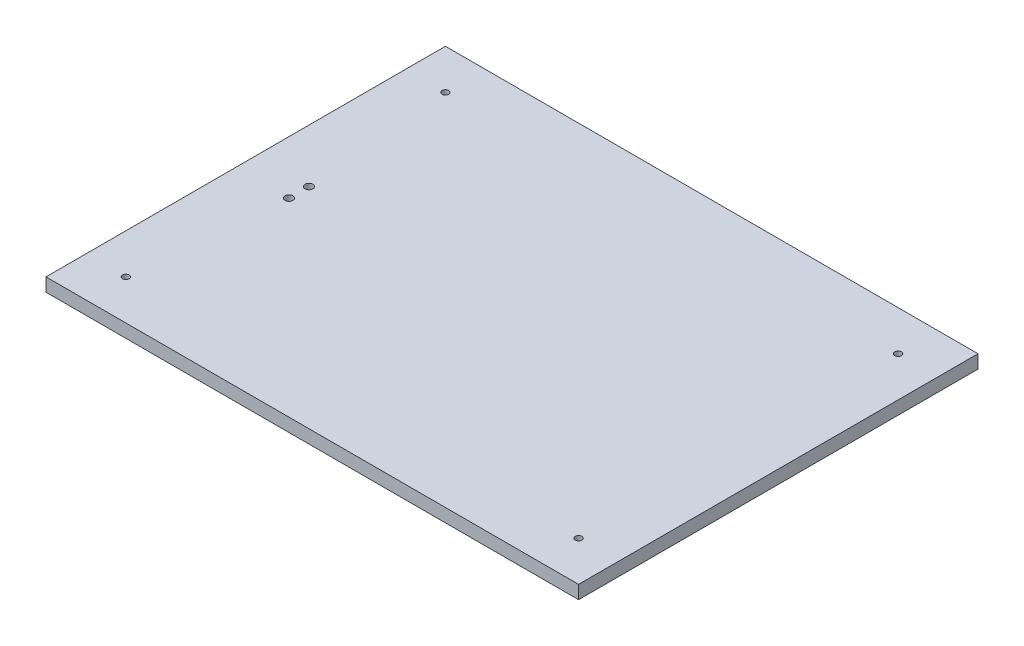
ISO-10303-21;
HEADER;
FILE_DESCRIPTION(('STEP AP214'),'2;1');
FILE_NAME('part.step','',(''),(''),'','','');
FILE_SCHEMA(('AUTOMOTIVE_DESIGN { 1 0 10303 214 1 1 1 1 }'));
ENDSEC;
DATA;
#1=APPLICATION_CONTEXT('core data for automotive mechanical design processes');
#2=APPLICATION_PROTOCOL_DEFINITION('international standard','automotive_design',2000,#1);
#3=PRODUCT_CONTEXT('',#1,'mechanical');
#4=PRODUCT('Part','Part','',(#3));
#5=PRODUCT_RELATED_PRODUCT_CATEGORY('part','',(#4));
#6=PRODUCT_DEFINITION_FORMATION('','',#4);
#7=PRODUCT_DEFINITION_CONTEXT('part definition',#1,'design');
#8=PRODUCT_DEFINITION('design','',#6,#7);
#9=PRODUCT_DEFINITION_SHAPE('','',#8);
#10=(LENGTH_UNIT() NAMED_UNIT(*) SI_UNIT(.MILLI.,.METRE.));
#11=(NAMED_UNIT(*) PLANE_ANGLE_UNIT() SI_UNIT($,.RADIAN.));
#12=(NAMED_UNIT(*) SI_UNIT($,.STERADIAN.) SOLID_ANGLE_UNIT());
#13=UNCERTAINTY_MEASURE_WITH_UNIT(LENGTH_MEASURE(1.E-05),#10,'distance_accuracy_value','');
#14=(GEOMETRIC_REPRESENTATION_CONTEXT(3) GLOBAL_UNCERTAINTY_ASSIGNED_CONTEXT((#13)) GLOBAL_UNIT_ASSIGNED_CONTEXT((#10,
#11,#12)) REPRESENTATION_CONTEXT('',''));
#15=CARTESIAN_POINT('',(0.,0.,0.));
#16=DIRECTION('',(0.,0.,1.));
#17=DIRECTION('',(1.,0.,0.));
#18=AXIS2_PLACEMENT_3D('',#15,#16,#17);
#19=CARTESIAN_POINT('',(0.,10.,0.));
#20=DIRECTION('',(0.,1.,0.));
#21=DIRECTION('',(0.,0.,1.));
#22=AXIS2_PLACEMENT_3D('',#19,#20,#21);
#23=PLANE('',#22);
#24=CARTESIAN_POINT('',(170.,10.,120.));
#25=DIRECTION('',(0.,1.,0.));
#26=DIRECTION('',(0.,0.,1.));
#27=AXIS2_PLACEMENT_3D('',#24,#25,#26);
#28=CIRCLE('',#27,2.5);
#29=CARTESIAN_POINT('',(170.,10.,122.5));
#30=VERTEX_POINT('',#29);
#31=EDGE_CURVE('E133',#30,#30,#28,.T.);
#32=ORIENTED_EDGE('',*,*,#31,.F.);
#33=EDGE_LOOP('',(#32));
#34=FACE_BOUND('',#33,.T.);
#35=CARTESIAN_POINT('',(-160.,10.,-7.50000000000003));
#36=DIRECTION('',(0.,1.,0.));
#37=DIRECTION('',(0.,0.,1.));
#38=AXIS2_PLACEMENT_3D('',#35,#36,#37);
#39=CIRCLE('',#38,2.99999999999999);
#40=CARTESIAN_POINT('',(-160.,10.,-4.50000000000004));
#41=VERTEX_POINT('',#40);
#42=EDGE_CURVE('E121',#41,#41,#39,.T.);
#43=ORIENTED_EDGE('',*,*,#42,.F.);
#44=EDGE_LOOP('',(#43));
#45=FACE_BOUND('',#44,.T.);
#46=CARTESIAN_POINT('',(-170.,10.,-120.));
#47=DIRECTION('',(0.,1.,0.));
#48=DIRECTION('',(0.,0.,1.));
#49=AXIS2_PLACEMENT_3D('',#46,#47,#48);
#50=CIRCLE('',#49,2.5);
#51=CARTESIAN_POINT('',(-170.,10.,-117.5));
#52=VERTEX_POINT('',#51);
#53=EDGE_CURVE('E100',#52,#52,#50,.T.);
#54=ORIENTED_EDGE('',*,*,#53,.F.);
#55=EDGE_LOOP('',(#54));
#56=FACE_BOUND('',#55,.T.);
#57=DIRECTION('',(0.,0.,1.));
#58=VECTOR('',#57,1.);
#59=CARTESIAN_POINT('',(-200.,10.,-150.));
#60=LINE('',#59,#58);
#61=CARTESIAN_POINT('',(-200.,10.,-150.));
#62=VERTEX_POINT('',#61);
#63=CARTESIAN_POINT('',(-200.,10.,150.));
#64=VERTEX_POINT('',#63);
#65=EDGE_CURVE('E85',#62,#64,#60,.T.);
#66=ORIENTED_EDGE('',*,*,#65,.T.);
#67=DIRECTION('',(1.,0.,0.));
#68=VECTOR('',#67,1.);
#69=CARTESIAN_POINT('',(-200.,10.,150.));
#70=LINE('',#69,#68);
#71=CARTESIAN_POINT('',(200.,10.,150.));
#72=VERTEX_POINT('',#71);
#73=EDGE_CURVE('E80',#64,#72,#70,.T.);
#74=ORIENTED_EDGE('',*,*,#73,.T.);
#75=DIRECTION('',(0.,0.,-1.));
#76=VECTOR('',#75,1.);
#77=CARTESIAN_POINT('',(200.,10.,-150.));
#78=LINE('',#77,#76);
#79=CARTESIAN_POINT('',(200.,10.,-150.));
#80=VERTEX_POINT('',#79);
#81=EDGE_CURVE('E83',#72,#80,#78,.T.);
#82=ORIENTED_EDGE('',*,*,#81,.T.);
#83=DIRECTION('',(-1.,0.,0.));
#84=VECTOR('',#83,1.);
#85=CARTESIAN_POINT('',(-200.,10.,-150.));
#86=LINE('',#85,#84);
#87=EDGE_CURVE('E50',#80,#62,#86,.T.);
#88=ORIENTED_EDGE('',*,*,#87,.T.);
#89=EDGE_LOOP('',(#66,#74,#82,#88));
#90=FACE_BOUND('',#89,.T.);
#91=CARTESIAN_POINT('',(170.,10.,-120.));
#92=DIRECTION('',(0.,1.,0.));
#93=DIRECTION('',(0.,0.,1.));
#94=AXIS2_PLACEMENT_3D('',#91,#92,#93);
#95=CIRCLE('',#94,2.5);
#96=CARTESIAN_POINT('',(170.,10.,-117.5));
#97=VERTEX_POINT('',#96);
#98=EDGE_CURVE('E115',#97,#97,#95,.T.);
#99=ORIENTED_EDGE('',*,*,#98,.F.);
#100=EDGE_LOOP('',(#99));
#101=FACE_BOUND('',#100,.T.);
#102=CARTESIAN_POINT('',(-160.,10.,7.5));
#103=DIRECTION('',(0.,1.,0.));
#104=DIRECTION('',(0.,0.,1.));
#105=AXIS2_PLACEMENT_3D('',#102,#103,#104);
#106=CIRCLE('',#105,2.99999999999999);
#107=CARTESIAN_POINT('',(-160.,10.,10.5));
#108=VERTEX_POINT('',#107);
#109=EDGE_CURVE('E127',#108,#108,#106,.T.);
#110=ORIENTED_EDGE('',*,*,#109,.F.);
#111=EDGE_LOOP('',(#110));
#112=FACE_BOUND('',#111,.T.);
#113=CARTESIAN_POINT('',(-170.,10.,120.));
#114=DIRECTION('',(0.,1.,0.));
#115=DIRECTION('',(0.,0.,1.));
#116=AXIS2_PLACEMENT_3D('',#113,#114,#115);
#117=CIRCLE('',#116,2.5);
#118=CARTESIAN_POINT('',(-170.,10.,122.5));
#119=VERTEX_POINT('',#118);
#120=EDGE_CURVE('E139',#119,#119,#117,.T.);
#121=ORIENTED_EDGE('',*,*,#120,.F.);
#122=EDGE_LOOP('',(#121));
#123=FACE_BOUND('',#122,.T.);
#124=ADVANCED_FACE('F33',(#34,#45,#56,#90,#101,#112,#123),#23,.T.);
#125=CARTESIAN_POINT('',(0.,0.,0.));
#126=DIRECTION('',(0.,1.,0.));
#127=DIRECTION('',(0.,0.,1.));
#128=AXIS2_PLACEMENT_3D('',#125,#126,#127);
#129=PLANE('',#128);
#130=DIRECTION('',(0.,0.,1.));
#131=VECTOR('',#130,1.);
#132=CARTESIAN_POINT('',(-200.,0.,-150.));
#133=LINE('',#132,#131);
#134=CARTESIAN_POINT('',(-200.,0.,-150.));
#135=VERTEX_POINT('',#134);
#136=CARTESIAN_POINT('',(-200.,0.,150.));
#137=VERTEX_POINT('',#136);
#138=EDGE_CURVE('E97',#135,#137,#133,.T.);
#139=ORIENTED_EDGE('',*,*,#138,.F.);
#140=DIRECTION('',(-1.,0.,0.));
#141=VECTOR('',#140,1.);
#142=CARTESIAN_POINT('',(-200.,0.,-150.));
#143=LINE('',#142,#141);
#144=CARTESIAN_POINT('',(200.,0.,-150.));
#145=VERTEX_POINT('',#144);
#146=EDGE_CURVE('E73',#145,#135,#143,.T.);
#147=ORIENTED_EDGE('',*,*,#146,.F.);
#148=DIRECTION('',(0.,0.,-1.));
#149=VECTOR('',#148,1.);
#150=CARTESIAN_POINT('',(200.,0.,-150.));
#151=LINE('',#150,#149);
#152=CARTESIAN_POINT('',(200.,0.,150.));
#153=VERTEX_POINT('',#152);
#154=EDGE_CURVE('E67',#153,#145,#151,.T.);
#155=ORIENTED_EDGE('',*,*,#154,.F.);
#156=DIRECTION('',(1.,0.,0.));
#157=VECTOR('',#156,1.);
#158=CARTESIAN_POINT('',(-200.,0.,150.));
#159=LINE('',#158,#157);
#160=EDGE_CURVE('E89',#137,#153,#159,.T.);
#161=ORIENTED_EDGE('',*,*,#160,.F.);
#162=EDGE_LOOP('',(#139,#147,#155,#161));
#163=FACE_BOUND('',#162,.T.);
#164=CARTESIAN_POINT('',(-170.,0.,-120.));
#165=DIRECTION('',(0.,1.,0.));
#166=DIRECTION('',(0.,0.,1.));
#167=AXIS2_PLACEMENT_3D('',#164,#165,#166);
#168=CIRCLE('',#167,2.5);
#169=CARTESIAN_POINT('',(-170.,0.,-117.5));
#170=VERTEX_POINT('',#169);
#171=EDGE_CURVE('E112',#170,#170,#168,.T.);
#172=ORIENTED_EDGE('',*,*,#171,.T.);
#173=EDGE_LOOP('',(#172));
#174=FACE_BOUND('',#173,.T.);
#175=CARTESIAN_POINT('',(170.,0.,-120.));
#176=DIRECTION('',(0.,1.,0.));
#177=DIRECTION('',(0.,0.,1.));
#178=AXIS2_PLACEMENT_3D('',#175,#176,#177);
#179=CIRCLE('',#178,2.5);
#180=CARTESIAN_POINT('',(170.,0.,-117.5));
#181=VERTEX_POINT('',#180);
#182=EDGE_CURVE('E118',#181,#181,#179,.T.);
#183=ORIENTED_EDGE('',*,*,#182,.T.);
#184=EDGE_LOOP('',(#183));
#185=FACE_BOUND('',#184,.T.);
#186=CARTESIAN_POINT('',(-160.,0.,-7.50000000000003));
#187=DIRECTION('',(0.,1.,0.));
#188=DIRECTION('',(0.,0.,1.));
#189=AXIS2_PLACEMENT_3D('',#186,#187,#188);
#190=CIRCLE('',#189,2.99999999999999);
#191=CARTESIAN_POINT('',(-160.,0.,-4.50000000000004));
#192=VERTEX_POINT('',#191);
#193=EDGE_CURVE('E124',#192,#192,#190,.T.);
#194=ORIENTED_EDGE('',*,*,#193,.T.);
#195=EDGE_LOOP('',(#194));
#196=FACE_BOUND('',#195,.T.);
#197=CARTESIAN_POINT('',(-160.,0.,7.5));
#198=DIRECTION('',(0.,1.,0.));
#199=DIRECTION('',(0.,0.,1.));
#200=AXIS2_PLACEMENT_3D('',#197,#198,#199);
#201=CIRCLE('',#200,2.99999999999999);
#202=CARTESIAN_POINT('',(-160.,0.,10.5));
#203=VERTEX_POINT('',#202);
#204=EDGE_CURVE('E130',#203,#203,#201,.T.);
#205=ORIENTED_EDGE('',*,*,#204,.T.);
#206=EDGE_LOOP('',(#205));
#207=FACE_BOUND('',#206,.T.);
#208=CARTESIAN_POINT('',(170.,0.,120.));
#209=DIRECTION('',(0.,1.,0.));
#210=DIRECTION('',(0.,0.,1.));
#211=AXIS2_PLACEMENT_3D('',#208,#209,#210);
#212=CIRCLE('',#211,2.5);
#213=CARTESIAN_POINT('',(170.,0.,122.5));
#214=VERTEX_POINT('',#213);
#215=EDGE_CURVE('E136',#214,#214,#212,.T.);
#216=ORIENTED_EDGE('',*,*,#215,.T.);
#217=EDGE_LOOP('',(#216));
#218=FACE_BOUND('',#217,.T.);
#219=CARTESIAN_POINT('',(-170.,0.,120.));
#220=DIRECTION('',(0.,1.,0.));
#221=DIRECTION('',(0.,0.,1.));
#222=AXIS2_PLACEMENT_3D('',#219,#220,#221);
#223=CIRCLE('',#222,2.5);
#224=CARTESIAN_POINT('',(-170.,0.,122.5));
#225=VERTEX_POINT('',#224);
#226=EDGE_CURVE('E142',#225,#225,#223,.T.);
#227=ORIENTED_EDGE('',*,*,#226,.T.);
#228=EDGE_LOOP('',(#227));
#229=FACE_BOUND('',#228,.T.);
#230=ADVANCED_FACE('F108',(#163,#174,#185,#196,#207,#218,#229),#129,.F.);
#231=CARTESIAN_POINT('',(-200.,10.,-150.));
#232=DIRECTION('',(1.,0.,0.));
#233=DIRECTION('',(0.,0.,-1.));
#234=AXIS2_PLACEMENT_3D('',#231,#232,#233);
#235=PLANE('',#234);
#236=ORIENTED_EDGE('',*,*,#138,.T.);
#237=DIRECTION('',(0.,-1.,0.));
#238=VECTOR('',#237,1.);
#239=CARTESIAN_POINT('',(-200.,10.,150.));
#240=LINE('',#239,#238);
#241=EDGE_CURVE('E11',#64,#137,#240,.T.);
#242=ORIENTED_EDGE('',*,*,#241,.F.);
#243=ORIENTED_EDGE('',*,*,#65,.F.);
#244=DIRECTION('',(0.,-1.,0.));
#245=VECTOR('',#244,1.);
#246=CARTESIAN_POINT('',(-200.,10.,-150.));
#247=LINE('',#246,#245);
#248=EDGE_CURVE('E93',#62,#135,#247,.T.);
#249=ORIENTED_EDGE('',*,*,#248,.T.);
#250=EDGE_LOOP('',(#236,#242,#243,#249));
#251=FACE_BOUND('',#250,.T.);
#252=ADVANCED_FACE('F35',(#251),#235,.F.);
#253=CARTESIAN_POINT('',(-200.,10.,150.));
#254=DIRECTION('',(0.,0.,-1.));
#255=DIRECTION('',(-1.,0.,0.));
#256=AXIS2_PLACEMENT_3D('',#253,#254,#255);
#257=PLANE('',#256);
#258=ORIENTED_EDGE('',*,*,#160,.T.);
#259=DIRECTION('',(0.,-1.,0.));
#260=VECTOR('',#259,1.);
#261=CARTESIAN_POINT('',(200.,10.,150.));
#262=LINE('',#261,#260);
#263=EDGE_CURVE('E42',#72,#153,#262,.T.);
#264=ORIENTED_EDGE('',*,*,#263,.F.);
#265=ORIENTED_EDGE('',*,*,#73,.F.);
#266=ORIENTED_EDGE('',*,*,#241,.T.);
#267=EDGE_LOOP('',(#258,#264,#265,#266));
#268=FACE_BOUND('',#267,.T.);
#269=ADVANCED_FACE('F88',(#268),#257,.F.);
#270=CARTESIAN_POINT('',(200.,10.,-150.));
#271=DIRECTION('',(-1.,0.,0.));
#272=DIRECTION('',(0.,0.,1.));
#273=AXIS2_PLACEMENT_3D('',#270,#271,#272);
#274=PLANE('',#273);
#275=ORIENTED_EDGE('',*,*,#154,.T.);
#276=DIRECTION('',(0.,-1.,0.));
#277=VECTOR('',#276,1.);
#278=CARTESIAN_POINT('',(200.,10.,-150.));
#279=LINE('',#278,#277);
#280=EDGE_CURVE('E90',#80,#145,#279,.T.);
#281=ORIENTED_EDGE('',*,*,#280,.F.);
#282=ORIENTED_EDGE('',*,*,#81,.F.);
#283=ORIENTED_EDGE('',*,*,#263,.T.);
#284=EDGE_LOOP('',(#275,#281,#282,#283));
#285=FACE_BOUND('',#284,.T.);
#286=ADVANCED_FACE('F91',(#285),#274,.F.);
#287=CARTESIAN_POINT('',(-200.,10.,-150.));
#288=DIRECTION('',(0.,0.,1.));
#289=DIRECTION('',(1.,0.,0.));
#290=AXIS2_PLACEMENT_3D('',#287,#288,#289);
#291=PLANE('',#290);
#292=ORIENTED_EDGE('',*,*,#146,.T.);
#293=ORIENTED_EDGE('',*,*,#248,.F.);
#294=ORIENTED_EDGE('',*,*,#87,.F.);
#295=ORIENTED_EDGE('',*,*,#280,.T.);
#296=EDGE_LOOP('',(#292,#293,#294,#295));
#297=FACE_BOUND('',#296,.T.);
#298=ADVANCED_FACE('F105',(#297),#291,.F.);
#299=CARTESIAN_POINT('',(-170.,10.,-120.));
#300=DIRECTION('',(0.,-1.,0.));
#301=DIRECTION('',(0.,0.,-1.));
#302=AXIS2_PLACEMENT_3D('',#299,#300,#301);
#303=CYLINDRICAL_SURFACE('',#302,2.5);
#304=ORIENTED_EDGE('',*,*,#53,.T.);
#305=EDGE_LOOP('',(#304));
#306=FACE_BOUND('',#305,.T.);
#307=ORIENTED_EDGE('',*,*,#171,.F.);
#308=EDGE_LOOP('',(#307));
#309=FACE_BOUND('',#308,.T.);
#310=ADVANCED_FACE('F161',(#306,#309),#303,.F.);
#311=CARTESIAN_POINT('',(170.,10.,-120.));
#312=DIRECTION('',(0.,-1.,0.));
#313=DIRECTION('',(0.,0.,-1.));
#314=AXIS2_PLACEMENT_3D('',#311,#312,#313);
#315=CYLINDRICAL_SURFACE('',#314,2.5);
#316=ORIENTED_EDGE('',*,*,#98,.T.);
#317=EDGE_LOOP('',(#316));
#318=FACE_BOUND('',#317,.T.);
#319=ORIENTED_EDGE('',*,*,#182,.F.);
#320=EDGE_LOOP('',(#319));
#321=FACE_BOUND('',#320,.T.);
#322=ADVANCED_FACE('F207',(#318,#321),#315,.F.);
#323=CARTESIAN_POINT('',(-160.,10.,-7.50000000000003));
#324=DIRECTION('',(0.,-1.,0.));
#325=DIRECTION('',(0.,0.,-1.));
#326=AXIS2_PLACEMENT_3D('',#323,#324,#325);
#327=CYLINDRICAL_SURFACE('',#326,2.99999999999999);
#328=ORIENTED_EDGE('',*,*,#42,.T.);
#329=EDGE_LOOP('',(#328));
#330=FACE_BOUND('',#329,.T.);
#331=ORIENTED_EDGE('',*,*,#193,.F.);
#332=EDGE_LOOP('',(#331));
#333=FACE_BOUND('',#332,.T.);
#334=ADVANCED_FACE('F215',(#330,#333),#327,.F.);
#335=CARTESIAN_POINT('',(-160.,10.,7.5));
#336=DIRECTION('',(0.,-1.,0.));
#337=DIRECTION('',(0.,0.,-1.));
#338=AXIS2_PLACEMENT_3D('',#335,#336,#337);
#339=CYLINDRICAL_SURFACE('',#338,2.99999999999999);
#340=ORIENTED_EDGE('',*,*,#109,.T.);
#341=EDGE_LOOP('',(#340));
#342=FACE_BOUND('',#341,.T.);
#343=ORIENTED_EDGE('',*,*,#204,.F.);
#344=EDGE_LOOP('',(#343));
#345=FACE_BOUND('',#344,.T.);
#346=ADVANCED_FACE('F223',(#342,#345),#339,.F.);
#347=CARTESIAN_POINT('',(170.,10.,120.));
#348=DIRECTION('',(0.,-1.,0.));
#349=DIRECTION('',(0.,0.,-1.));
#350=AXIS2_PLACEMENT_3D('',#347,#348,#349);
#351=CYLINDRICAL_SURFACE('',#350,2.5);
#352=ORIENTED_EDGE('',*,*,#31,.T.);
#353=EDGE_LOOP('',(#352));
#354=FACE_BOUND('',#353,.T.);
#355=ORIENTED_EDGE('',*,*,#215,.F.);
#356=EDGE_LOOP('',(#355));
#357=FACE_BOUND('',#356,.T.);
#358=ADVANCED_FACE('F232',(#354,#357),#351,.F.);
#359=CARTESIAN_POINT('',(-170.,10.,120.));
#360=DIRECTION('',(0.,-1.,0.));
#361=DIRECTION('',(0.,0.,-1.));
#362=AXIS2_PLACEMENT_3D('',#359,#360,#361);
#363=CYLINDRICAL_SURFACE('',#362,2.5);
#364=ORIENTED_EDGE('',*,*,#120,.T.);
#365=EDGE_LOOP('',(#364));
#366=FACE_BOUND('',#365,.T.);
#367=ORIENTED_EDGE('',*,*,#226,.F.);
#368=EDGE_LOOP('',(#367));
#369=FACE_BOUND('',#368,.T.);
#370=ADVANCED_FACE('F148',(#366,#369),#363,.F.);
#371=CLOSED_SHELL('',(#124,#230,#252,#269,#286,#298,#310,#322,#334,#346,#358,#370));
#372=MANIFOLD_SOLID_BREP('B2',#371);
#373=ADVANCED_BREP_SHAPE_REPRESENTATION('',(#18,#372),#14);
#374=SHAPE_DEFINITION_REPRESENTATION(#9,#373);
ENDSEC;
END-ISO-10303-21;
